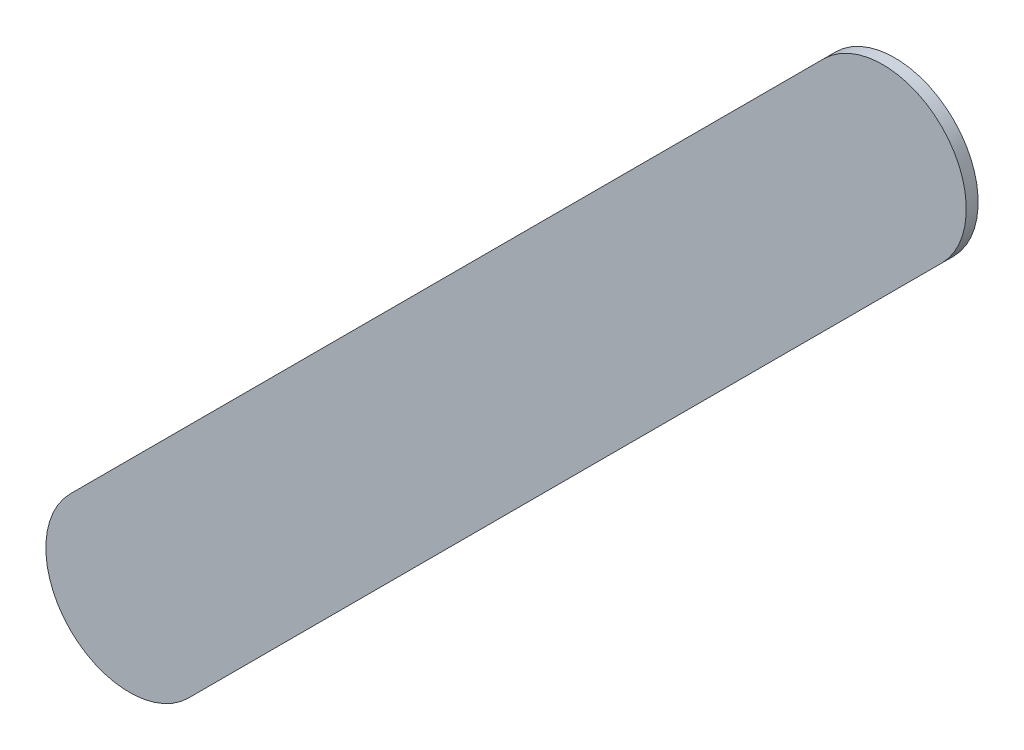
ISO-10303-21;
HEADER;
FILE_DESCRIPTION(('STEP AP214'),'2;1');
FILE_NAME('part.step','',(''),(''),'','','');
FILE_SCHEMA(('AUTOMOTIVE_DESIGN { 1 0 10303 214 1 1 1 1 }'));
ENDSEC;
DATA;
#1=APPLICATION_CONTEXT('core data for automotive mechanical design processes');
#2=APPLICATION_PROTOCOL_DEFINITION('international standard','automotive_design',2000,#1);
#3=PRODUCT_CONTEXT('',#1,'mechanical');
#4=PRODUCT('Part','Part','',(#3));
#5=PRODUCT_RELATED_PRODUCT_CATEGORY('part','',(#4));
#6=PRODUCT_DEFINITION_FORMATION('','',#4);
#7=PRODUCT_DEFINITION_CONTEXT('part definition',#1,'design');
#8=PRODUCT_DEFINITION('design','',#6,#7);
#9=PRODUCT_DEFINITION_SHAPE('','',#8);
#10=(LENGTH_UNIT() NAMED_UNIT(*) SI_UNIT(.MILLI.,.METRE.));
#11=(NAMED_UNIT(*) PLANE_ANGLE_UNIT() SI_UNIT($,.RADIAN.));
#12=(NAMED_UNIT(*) SI_UNIT($,.STERADIAN.) SOLID_ANGLE_UNIT());
#13=UNCERTAINTY_MEASURE_WITH_UNIT(LENGTH_MEASURE(1.E-05),#10,'distance_accuracy_value','');
#14=(GEOMETRIC_REPRESENTATION_CONTEXT(3) GLOBAL_UNCERTAINTY_ASSIGNED_CONTEXT((#13)) GLOBAL_UNIT_ASSIGNED_CONTEXT((#10,
#11,#12)) REPRESENTATION_CONTEXT('',''));
#15=CARTESIAN_POINT('',(0.,0.,0.));
#16=DIRECTION('',(0.,0.,1.));
#17=DIRECTION('',(1.,0.,0.));
#18=AXIS2_PLACEMENT_3D('',#15,#16,#17);
#19=CARTESIAN_POINT('',(37.81848926,102.0649343,0.));
#20=DIRECTION('',(-0.707106781186546,0.707106781186549,0.));
#21=DIRECTION('',(0.707106781186549,0.707106781186546,0.));
#22=AXIS2_PLACEMENT_3D('',#19,#20,#21);
#23=PLANE('',#22);
#24=DIRECTION('',(0.707106781186549,0.707106781186546,0.));
#25=VECTOR('',#24,1.);
#26=CARTESIAN_POINT('',(37.81848926,102.0649343,0.03556));
#27=LINE('',#26,#25);
#28=CARTESIAN_POINT('',(37.81848926,102.0649343,0.03556));
#29=VERTEX_POINT('',#28);
#30=CARTESIAN_POINT('',(40.07677786,104.3232229,0.03556));
#31=VERTEX_POINT('',#30);
#32=EDGE_CURVE('E11',#29,#31,#27,.T.);
#33=ORIENTED_EDGE('',*,*,#32,.F.);
#34=DIRECTION('',(0.,0.,1.));
#35=VECTOR('',#34,1.);
#36=CARTESIAN_POINT('',(37.81848926,102.0649343,0.));
#37=LINE('',#36,#35);
#38=CARTESIAN_POINT('',(37.81848926,102.0649343,0.));
#39=VERTEX_POINT('',#38);
#40=EDGE_CURVE('E24',#39,#29,#37,.T.);
#41=ORIENTED_EDGE('',*,*,#40,.F.);
#42=DIRECTION('',(0.707106781186549,0.707106781186546,0.));
#43=VECTOR('',#42,1.);
#44=CARTESIAN_POINT('',(37.81848926,102.0649343,0.));
#45=LINE('',#44,#43);
#46=CARTESIAN_POINT('',(40.07677786,104.3232229,0.));
#47=VERTEX_POINT('',#46);
#48=EDGE_CURVE('E75',#39,#47,#45,.T.);
#49=ORIENTED_EDGE('',*,*,#48,.T.);
#50=DIRECTION('',(0.,0.,1.));
#51=VECTOR('',#50,1.);
#52=CARTESIAN_POINT('',(40.07677786,104.3232229,0.));
#53=LINE('',#52,#51);
#54=EDGE_CURVE('E37',#47,#31,#53,.T.);
#55=ORIENTED_EDGE('',*,*,#54,.T.);
#56=EDGE_LOOP('',(#33,#41,#49,#55));
#57=FACE_BOUND('',#56,.T.);
#58=ADVANCED_FACE('F17',(#57),#23,.F.);
#59=CARTESIAN_POINT('',(39.90000148,104.49999928,0.));
#60=DIRECTION('',(0.,0.,-1.));
#61=DIRECTION('',(0.707106781186519,-0.707106781186576,0.));
#62=AXIS2_PLACEMENT_3D('',#59,#60,#61);
#63=CYLINDRICAL_SURFACE('',#62,0.249999554103215);
#64=CARTESIAN_POINT('',(39.90000148,104.49999928,0.03556));
#65=DIRECTION('',(0.,0.,1.));
#66=DIRECTION('',(0.707106781186519,-0.707106781186576,0.));
#67=AXIS2_PLACEMENT_3D('',#64,#65,#66);
#68=CIRCLE('',#67,0.249999554103215);
#69=CARTESIAN_POINT('',(39.7232251,104.67677566,0.03556));
#70=VERTEX_POINT('',#69);
#71=EDGE_CURVE('E83',#31,#70,#68,.T.);
#72=ORIENTED_EDGE('',*,*,#71,.F.);
#73=ORIENTED_EDGE('',*,*,#54,.F.);
#74=CARTESIAN_POINT('',(39.90000148,104.49999928,0.));
#75=DIRECTION('',(0.,0.,1.));
#76=DIRECTION('',(0.707106781186519,-0.707106781186576,0.));
#77=AXIS2_PLACEMENT_3D('',#74,#75,#76);
#78=CIRCLE('',#77,0.249999554103215);
#79=CARTESIAN_POINT('',(39.7232251,104.67677566,0.));
#80=VERTEX_POINT('',#79);
#81=EDGE_CURVE('E81',#47,#80,#78,.T.);
#82=ORIENTED_EDGE('',*,*,#81,.T.);
#83=DIRECTION('',(0.,0.,1.));
#84=VECTOR('',#83,1.);
#85=CARTESIAN_POINT('',(39.7232251,104.67677566,0.));
#86=LINE('',#85,#84);
#87=EDGE_CURVE('E67',#80,#70,#86,.T.);
#88=ORIENTED_EDGE('',*,*,#87,.T.);
#89=EDGE_LOOP('',(#72,#73,#82,#88));
#90=FACE_BOUND('',#89,.T.);
#91=ADVANCED_FACE('F89',(#90),#63,.T.);
#92=CARTESIAN_POINT('',(39.7232251,104.67677566,0.));
#93=DIRECTION('',(0.707106781186548,-0.707106781186548,0.));
#94=DIRECTION('',(-0.707106781186548,-0.707106781186548,0.));
#95=AXIS2_PLACEMENT_3D('',#92,#93,#94);
#96=PLANE('',#95);
#97=DIRECTION('',(-0.707106781186548,-0.707106781186548,0.));
#98=VECTOR('',#97,1.);
#99=CARTESIAN_POINT('',(39.7232251,104.67677566,0.03556));
#100=LINE('',#99,#98);
#101=CARTESIAN_POINT('',(37.4649365,102.41848706,0.03556));
#102=VERTEX_POINT('',#101);
#103=EDGE_CURVE('E71',#70,#102,#100,.T.);
#104=ORIENTED_EDGE('',*,*,#103,.F.);
#105=ORIENTED_EDGE('',*,*,#87,.F.);
#106=DIRECTION('',(-0.707106781186548,-0.707106781186548,0.));
#107=VECTOR('',#106,1.);
#108=CARTESIAN_POINT('',(39.7232251,104.67677566,0.));
#109=LINE('',#108,#107);
#110=CARTESIAN_POINT('',(37.4649365,102.41848706,0.));
#111=VERTEX_POINT('',#110);
#112=EDGE_CURVE('E63',#80,#111,#109,.T.);
#113=ORIENTED_EDGE('',*,*,#112,.T.);
#114=DIRECTION('',(0.,0.,1.));
#115=VECTOR('',#114,1.);
#116=CARTESIAN_POINT('',(37.4649365,102.41848706,0.));
#117=LINE('',#116,#115);
#118=EDGE_CURVE('E53',#111,#102,#117,.T.);
#119=ORIENTED_EDGE('',*,*,#118,.T.);
#120=EDGE_LOOP('',(#104,#105,#113,#119));
#121=FACE_BOUND('',#120,.T.);
#122=ADVANCED_FACE('F66',(#121),#96,.F.);
#123=CARTESIAN_POINT('',(37.64171288,102.24171068,0.));
#124=DIRECTION('',(0.,0.,-1.));
#125=DIRECTION('',(-0.707106781186562,0.707106781186533,0.));
#126=AXIS2_PLACEMENT_3D('',#123,#124,#125);
#127=CYLINDRICAL_SURFACE('',#126,0.249999554103215);
#128=CARTESIAN_POINT('',(37.64171288,102.24171068,0.03556));
#129=DIRECTION('',(0.,0.,1.));
#130=DIRECTION('',(-0.707106781186562,0.707106781186533,0.));
#131=AXIS2_PLACEMENT_3D('',#128,#129,#130);
#132=CIRCLE('',#131,0.249999554103215);
#133=EDGE_CURVE('E59',#102,#29,#132,.T.);
#134=ORIENTED_EDGE('',*,*,#133,.F.);
#135=ORIENTED_EDGE('',*,*,#118,.F.);
#136=CARTESIAN_POINT('',(37.64171288,102.24171068,0.));
#137=DIRECTION('',(0.,0.,1.));
#138=DIRECTION('',(-0.707106781186562,0.707106781186533,0.));
#139=AXIS2_PLACEMENT_3D('',#136,#137,#138);
#140=CIRCLE('',#139,0.249999554103215);
#141=EDGE_CURVE('E57',#111,#39,#140,.T.);
#142=ORIENTED_EDGE('',*,*,#141,.T.);
#143=ORIENTED_EDGE('',*,*,#40,.T.);
#144=EDGE_LOOP('',(#134,#135,#142,#143));
#145=FACE_BOUND('',#144,.T.);
#146=ADVANCED_FACE('F55',(#145),#127,.T.);
#147=CARTESIAN_POINT('',(37.81848926,102.0649343,0.));
#148=DIRECTION('',(0.,0.,-1.));
#149=DIRECTION('',(-1.,0.,0.));
#150=AXIS2_PLACEMENT_3D('',#147,#148,#149);
#151=PLANE('',#150);
#152=ORIENTED_EDGE('',*,*,#141,.F.);
#153=ORIENTED_EDGE('',*,*,#112,.F.);
#154=ORIENTED_EDGE('',*,*,#81,.F.);
#155=ORIENTED_EDGE('',*,*,#48,.F.);
#156=EDGE_LOOP('',(#152,#153,#154,#155));
#157=FACE_BOUND('',#156,.T.);
#158=ADVANCED_FACE('F74',(#157),#151,.T.);
#159=CARTESIAN_POINT('',(37.81848926,102.0649343,0.03556));
#160=DIRECTION('',(0.,0.,-1.));
#161=DIRECTION('',(-1.,0.,0.));
#162=AXIS2_PLACEMENT_3D('',#159,#160,#161);
#163=PLANE('',#162);
#164=ORIENTED_EDGE('',*,*,#32,.T.);
#165=ORIENTED_EDGE('',*,*,#71,.T.);
#166=ORIENTED_EDGE('',*,*,#103,.T.);
#167=ORIENTED_EDGE('',*,*,#133,.T.);
#168=EDGE_LOOP('',(#164,#165,#166,#167));
#169=FACE_BOUND('',#168,.T.);
#170=ADVANCED_FACE('F91',(#169),#163,.F.);
#171=CLOSED_SHELL('',(#58,#91,#122,#146,#158,#170));
#172=MANIFOLD_SOLID_BREP('B1',#171);
#173=ADVANCED_BREP_SHAPE_REPRESENTATION('',(#18,#172),#14);
#174=SHAPE_DEFINITION_REPRESENTATION(#9,#173);
ENDSEC;
END-ISO-10303-21;
